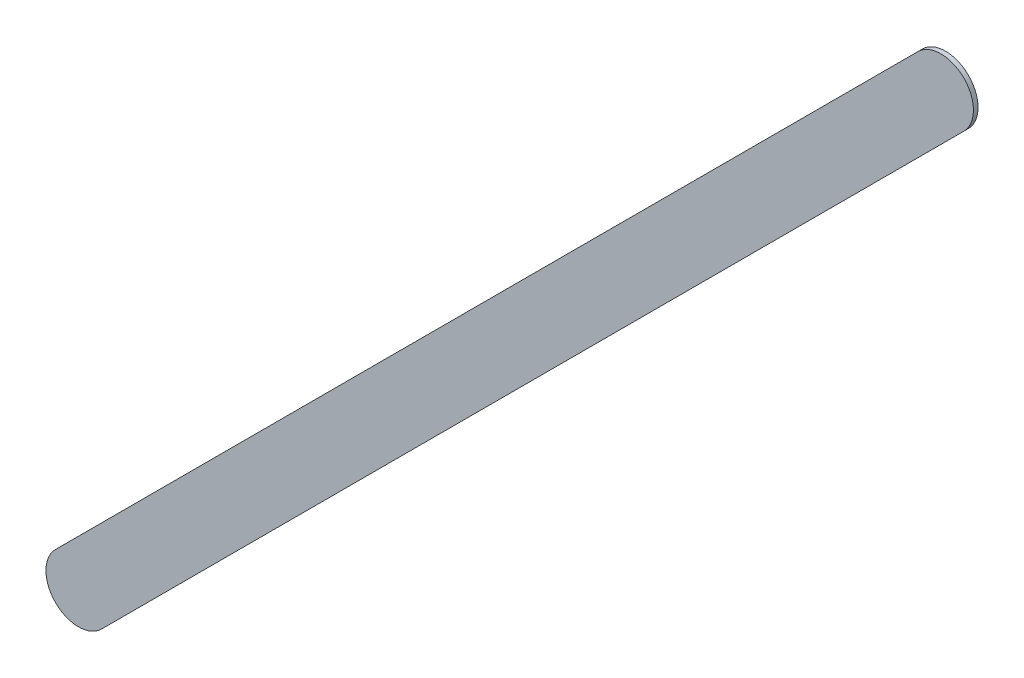
ISO-10303-21;
HEADER;
FILE_DESCRIPTION(('STEP AP214'),'2;1');
FILE_NAME('part.step','',(''),(''),'','','');
FILE_SCHEMA(('AUTOMOTIVE_DESIGN { 1 0 10303 214 1 1 1 1 }'));
ENDSEC;
DATA;
#1=APPLICATION_CONTEXT('core data for automotive mechanical design processes');
#2=APPLICATION_PROTOCOL_DEFINITION('international standard','automotive_design',2000,#1);
#3=PRODUCT_CONTEXT('',#1,'mechanical');
#4=PRODUCT('Part','Part','',(#3));
#5=PRODUCT_RELATED_PRODUCT_CATEGORY('part','',(#4));
#6=PRODUCT_DEFINITION_FORMATION('','',#4);
#7=PRODUCT_DEFINITION_CONTEXT('part definition',#1,'design');
#8=PRODUCT_DEFINITION('design','',#6,#7);
#9=PRODUCT_DEFINITION_SHAPE('','',#8);
#10=(LENGTH_UNIT() NAMED_UNIT(*) SI_UNIT(.MILLI.,.METRE.));
#11=(NAMED_UNIT(*) PLANE_ANGLE_UNIT() SI_UNIT($,.RADIAN.));
#12=(NAMED_UNIT(*) SI_UNIT($,.STERADIAN.) SOLID_ANGLE_UNIT());
#13=UNCERTAINTY_MEASURE_WITH_UNIT(LENGTH_MEASURE(1.E-05),#10,'distance_accuracy_value','');
#14=(GEOMETRIC_REPRESENTATION_CONTEXT(3) GLOBAL_UNCERTAINTY_ASSIGNED_CONTEXT((#13)) GLOBAL_UNIT_ASSIGNED_CONTEXT((#10,
#11,#12)) REPRESENTATION_CONTEXT('',''));
#15=CARTESIAN_POINT('',(0.,0.,0.));
#16=DIRECTION('',(0.,0.,1.));
#17=DIRECTION('',(1.,0.,0.));
#18=AXIS2_PLACEMENT_3D('',#15,#16,#17);
#19=CARTESIAN_POINT('',(35.4443538,105.19080054,0.));
#20=DIRECTION('',(-0.707106781186548,0.707106781186547,0.));
#21=DIRECTION('',(0.707106781186547,0.707106781186548,0.));
#22=AXIS2_PLACEMENT_3D('',#19,#20,#21);
#23=PLANE('',#22);
#24=DIRECTION('',(0.707106781186547,0.707106781186548,0.));
#25=VECTOR('',#24,1.);
#26=CARTESIAN_POINT('',(35.4443538,105.19080054,0.03556));
#27=LINE('',#26,#25);
#28=CARTESIAN_POINT('',(35.4443538,105.19080054,0.03556));
#29=VERTEX_POINT('',#28);
#30=CARTESIAN_POINT('',(42.0767764,111.82322314,0.03556));
#31=VERTEX_POINT('',#30);
#32=EDGE_CURVE('E11',#29,#31,#27,.T.);
#33=ORIENTED_EDGE('',*,*,#32,.F.);
#34=DIRECTION('',(0.,0.,1.));
#35=VECTOR('',#34,1.);
#36=CARTESIAN_POINT('',(35.4443538,105.19080054,0.));
#37=LINE('',#36,#35);
#38=CARTESIAN_POINT('',(35.4443538,105.19080054,0.));
#39=VERTEX_POINT('',#38);
#40=EDGE_CURVE('E24',#39,#29,#37,.T.);
#41=ORIENTED_EDGE('',*,*,#40,.F.);
#42=DIRECTION('',(0.707106781186547,0.707106781186548,0.));
#43=VECTOR('',#42,1.);
#44=CARTESIAN_POINT('',(35.4443538,105.19080054,0.));
#45=LINE('',#44,#43);
#46=CARTESIAN_POINT('',(42.0767764,111.82322314,0.));
#47=VERTEX_POINT('',#46);
#48=EDGE_CURVE('E75',#39,#47,#45,.T.);
#49=ORIENTED_EDGE('',*,*,#48,.T.);
#50=DIRECTION('',(0.,0.,1.));
#51=VECTOR('',#50,1.);
#52=CARTESIAN_POINT('',(42.0767764,111.82322314,0.));
#53=LINE('',#52,#51);
#54=EDGE_CURVE('E37',#47,#31,#53,.T.);
#55=ORIENTED_EDGE('',*,*,#54,.T.);
#56=EDGE_LOOP('',(#33,#41,#49,#55));
#57=FACE_BOUND('',#56,.T.);
#58=ADVANCED_FACE('F17',(#57),#23,.F.);
#59=CARTESIAN_POINT('',(41.90000002,111.99999952,0.));
#60=DIRECTION('',(0.,0.,-1.));
#61=DIRECTION('',(0.707106781186562,-0.707106781186533,0.));
#62=AXIS2_PLACEMENT_3D('',#59,#60,#61);
#63=CYLINDRICAL_SURFACE('',#62,0.249999554103215);
#64=CARTESIAN_POINT('',(41.90000002,111.99999952,0.03556));
#65=DIRECTION('',(0.,0.,1.));
#66=DIRECTION('',(0.707106781186562,-0.707106781186533,0.));
#67=AXIS2_PLACEMENT_3D('',#64,#65,#66);
#68=CIRCLE('',#67,0.249999554103215);
#69=CARTESIAN_POINT('',(41.72322364,112.1767759,0.03556));
#70=VERTEX_POINT('',#69);
#71=EDGE_CURVE('E83',#31,#70,#68,.T.);
#72=ORIENTED_EDGE('',*,*,#71,.F.);
#73=ORIENTED_EDGE('',*,*,#54,.F.);
#74=CARTESIAN_POINT('',(41.90000002,111.99999952,0.));
#75=DIRECTION('',(0.,0.,1.));
#76=DIRECTION('',(0.707106781186562,-0.707106781186533,0.));
#77=AXIS2_PLACEMENT_3D('',#74,#75,#76);
#78=CIRCLE('',#77,0.249999554103215);
#79=CARTESIAN_POINT('',(41.72322364,112.1767759,0.));
#80=VERTEX_POINT('',#79);
#81=EDGE_CURVE('E81',#47,#80,#78,.T.);
#82=ORIENTED_EDGE('',*,*,#81,.T.);
#83=DIRECTION('',(0.,0.,1.));
#84=VECTOR('',#83,1.);
#85=CARTESIAN_POINT('',(41.72322364,112.1767759,0.));
#86=LINE('',#85,#84);
#87=EDGE_CURVE('E67',#80,#70,#86,.T.);
#88=ORIENTED_EDGE('',*,*,#87,.T.);
#89=EDGE_LOOP('',(#72,#73,#82,#88));
#90=FACE_BOUND('',#89,.T.);
#91=ADVANCED_FACE('F89',(#90),#63,.T.);
#92=CARTESIAN_POINT('',(41.72322364,112.1767759,0.));
#93=DIRECTION('',(0.707106781186546,-0.70710678118655,0.));
#94=DIRECTION('',(-0.70710678118655,-0.707106781186546,0.));
#95=AXIS2_PLACEMENT_3D('',#92,#93,#94);
#96=PLANE('',#95);
#97=DIRECTION('',(-0.707106781186549,-0.707106781186546,0.));
#98=VECTOR('',#97,1.);
#99=CARTESIAN_POINT('',(41.72322364,112.1767759,0.03556));
#100=LINE('',#99,#98);
#101=CARTESIAN_POINT('',(35.09080104,105.5443533,0.03556));
#102=VERTEX_POINT('',#101);
#103=EDGE_CURVE('E71',#70,#102,#100,.T.);
#104=ORIENTED_EDGE('',*,*,#103,.F.);
#105=ORIENTED_EDGE('',*,*,#87,.F.);
#106=DIRECTION('',(-0.707106781186549,-0.707106781186546,0.));
#107=VECTOR('',#106,1.);
#108=CARTESIAN_POINT('',(41.72322364,112.1767759,0.));
#109=LINE('',#108,#107);
#110=CARTESIAN_POINT('',(35.09080104,105.5443533,0.));
#111=VERTEX_POINT('',#110);
#112=EDGE_CURVE('E63',#80,#111,#109,.T.);
#113=ORIENTED_EDGE('',*,*,#112,.T.);
#114=DIRECTION('',(0.,0.,1.));
#115=VECTOR('',#114,1.);
#116=CARTESIAN_POINT('',(35.09080104,105.5443533,0.));
#117=LINE('',#116,#115);
#118=EDGE_CURVE('E53',#111,#102,#117,.T.);
#119=ORIENTED_EDGE('',*,*,#118,.T.);
#120=EDGE_LOOP('',(#104,#105,#113,#119));
#121=FACE_BOUND('',#120,.T.);
#122=ADVANCED_FACE('F66',(#121),#96,.F.);
#123=CARTESIAN_POINT('',(35.26757742,105.36757692,0.));
#124=DIRECTION('',(0.,0.,-1.));
#125=DIRECTION('',(-0.707106781186533,0.707106781186562,0.));
#126=AXIS2_PLACEMENT_3D('',#123,#124,#125);
#127=CYLINDRICAL_SURFACE('',#126,0.249999554103233);
#128=CARTESIAN_POINT('',(35.26757742,105.36757692,0.03556));
#129=DIRECTION('',(0.,0.,1.));
#130=DIRECTION('',(-0.707106781186533,0.707106781186562,0.));
#131=AXIS2_PLACEMENT_3D('',#128,#129,#130);
#132=CIRCLE('',#131,0.249999554103233);
#133=EDGE_CURVE('E59',#102,#29,#132,.T.);
#134=ORIENTED_EDGE('',*,*,#133,.F.);
#135=ORIENTED_EDGE('',*,*,#118,.F.);
#136=CARTESIAN_POINT('',(35.26757742,105.36757692,0.));
#137=DIRECTION('',(0.,0.,1.));
#138=DIRECTION('',(-0.707106781186533,0.707106781186562,0.));
#139=AXIS2_PLACEMENT_3D('',#136,#137,#138);
#140=CIRCLE('',#139,0.249999554103233);
#141=EDGE_CURVE('E57',#111,#39,#140,.T.);
#142=ORIENTED_EDGE('',*,*,#141,.T.);
#143=ORIENTED_EDGE('',*,*,#40,.T.);
#144=EDGE_LOOP('',(#134,#135,#142,#143));
#145=FACE_BOUND('',#144,.T.);
#146=ADVANCED_FACE('F55',(#145),#127,.T.);
#147=CARTESIAN_POINT('',(35.4443538,105.19080054,0.));
#148=DIRECTION('',(0.,0.,-1.));
#149=DIRECTION('',(-1.,0.,0.));
#150=AXIS2_PLACEMENT_3D('',#147,#148,#149);
#151=PLANE('',#150);
#152=ORIENTED_EDGE('',*,*,#141,.F.);
#153=ORIENTED_EDGE('',*,*,#112,.F.);
#154=ORIENTED_EDGE('',*,*,#81,.F.);
#155=ORIENTED_EDGE('',*,*,#48,.F.);
#156=EDGE_LOOP('',(#152,#153,#154,#155));
#157=FACE_BOUND('',#156,.T.);
#158=ADVANCED_FACE('F74',(#157),#151,.T.);
#159=CARTESIAN_POINT('',(35.4443538,105.19080054,0.03556));
#160=DIRECTION('',(0.,0.,-1.));
#161=DIRECTION('',(-1.,0.,0.));
#162=AXIS2_PLACEMENT_3D('',#159,#160,#161);
#163=PLANE('',#162);
#164=ORIENTED_EDGE('',*,*,#32,.T.);
#165=ORIENTED_EDGE('',*,*,#71,.T.);
#166=ORIENTED_EDGE('',*,*,#103,.T.);
#167=ORIENTED_EDGE('',*,*,#133,.T.);
#168=EDGE_LOOP('',(#164,#165,#166,#167));
#169=FACE_BOUND('',#168,.T.);
#170=ADVANCED_FACE('F91',(#169),#163,.F.);
#171=CLOSED_SHELL('',(#58,#91,#122,#146,#158,#170));
#172=MANIFOLD_SOLID_BREP('B1',#171);
#173=ADVANCED_BREP_SHAPE_REPRESENTATION('',(#18,#172),#14);
#174=SHAPE_DEFINITION_REPRESENTATION(#9,#173);
ENDSEC;
END-ISO-10303-21;
